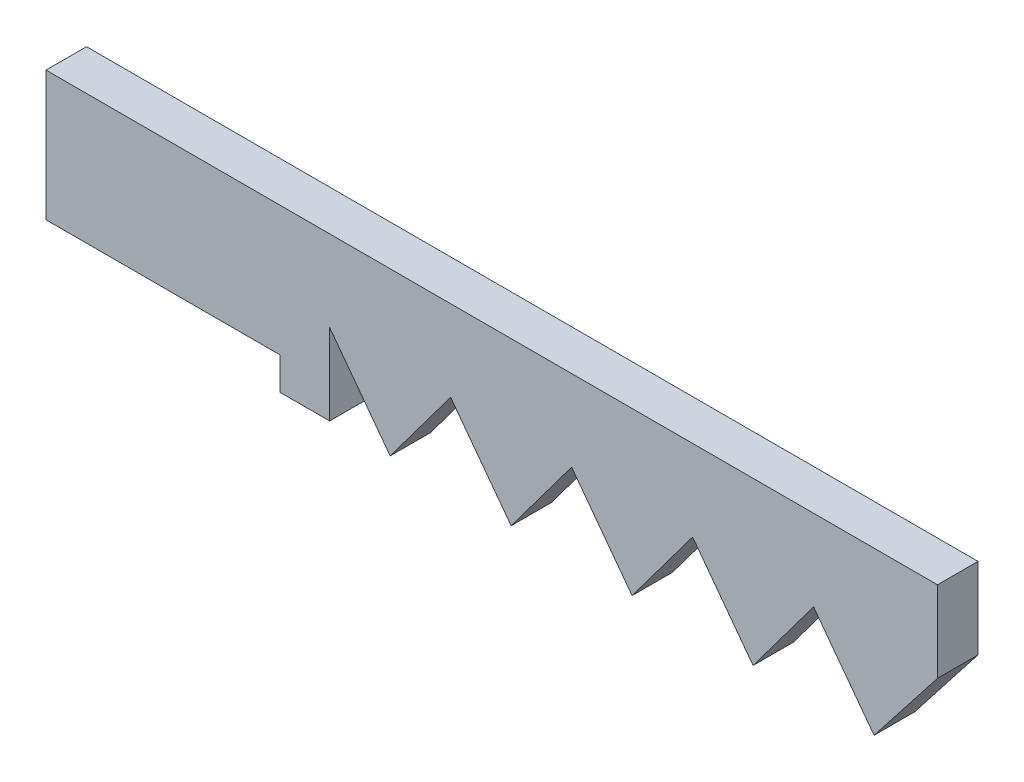
ISO-10303-21;
HEADER;
FILE_DESCRIPTION(('STEP AP214'),'2;1');
FILE_NAME('part.step','',(''),(''),'','','');
FILE_SCHEMA(('AUTOMOTIVE_DESIGN { 1 0 10303 214 1 1 1 1 }'));
ENDSEC;
DATA;
#1=APPLICATION_CONTEXT('core data for automotive mechanical design processes');
#2=APPLICATION_PROTOCOL_DEFINITION('international standard','automotive_design',2000,#1);
#3=PRODUCT_CONTEXT('',#1,'mechanical');
#4=PRODUCT('Part','Part','',(#3));
#5=PRODUCT_RELATED_PRODUCT_CATEGORY('part','',(#4));
#6=PRODUCT_DEFINITION_FORMATION('','',#4);
#7=PRODUCT_DEFINITION_CONTEXT('part definition',#1,'design');
#8=PRODUCT_DEFINITION('design','',#6,#7);
#9=PRODUCT_DEFINITION_SHAPE('','',#8);
#10=(LENGTH_UNIT() NAMED_UNIT(*) SI_UNIT(.MILLI.,.METRE.));
#11=(NAMED_UNIT(*) PLANE_ANGLE_UNIT() SI_UNIT($,.RADIAN.));
#12=(NAMED_UNIT(*) SI_UNIT($,.STERADIAN.) SOLID_ANGLE_UNIT());
#13=UNCERTAINTY_MEASURE_WITH_UNIT(LENGTH_MEASURE(1.E-05),#10,'distance_accuracy_value','');
#14=(GEOMETRIC_REPRESENTATION_CONTEXT(3) GLOBAL_UNCERTAINTY_ASSIGNED_CONTEXT((#13)) GLOBAL_UNIT_ASSIGNED_CONTEXT((#10,
#11,#12)) REPRESENTATION_CONTEXT('',''));
#15=CARTESIAN_POINT('',(0.,0.,0.));
#16=DIRECTION('',(0.,0.,1.));
#17=DIRECTION('',(1.,0.,0.));
#18=AXIS2_PLACEMENT_3D('',#15,#16,#17);
#19=CARTESIAN_POINT('',(-27.94,0.,2.54));
#20=DIRECTION('',(1.,0.,0.));
#21=DIRECTION('',(0.,1.,0.));
#22=AXIS2_PLACEMENT_3D('',#19,#20,#21);
#23=PLANE('',#22);
#24=DIRECTION('',(0.,0.,-1.));
#25=VECTOR('',#24,1.);
#26=CARTESIAN_POINT('',(-27.94,2.032,0.));
#27=LINE('',#26,#25);
#28=CARTESIAN_POINT('',(-27.94,2.032,2.54));
#29=VERTEX_POINT('',#28);
#30=CARTESIAN_POINT('',(-27.94,2.032,0.));
#31=VERTEX_POINT('',#30);
#32=EDGE_CURVE('E345',#29,#31,#27,.T.);
#33=ORIENTED_EDGE('',*,*,#32,.F.);
#34=DIRECTION('',(0.,-1.,0.));
#35=VECTOR('',#34,1.);
#36=CARTESIAN_POINT('',(-27.94,0.,2.54));
#37=LINE('',#36,#35);
#38=CARTESIAN_POINT('',(-27.94,10.16,2.54));
#39=VERTEX_POINT('',#38);
#40=EDGE_CURVE('E242',#39,#29,#37,.T.);
#41=ORIENTED_EDGE('',*,*,#40,.F.);
#42=DIRECTION('',(0.,0.,-1.));
#43=VECTOR('',#42,1.);
#44=CARTESIAN_POINT('',(-27.94,10.16,2.54));
#45=LINE('',#44,#43);
#46=CARTESIAN_POINT('',(-27.94,10.16,0.));
#47=VERTEX_POINT('',#46);
#48=EDGE_CURVE('E194',#39,#47,#45,.T.);
#49=ORIENTED_EDGE('',*,*,#48,.T.);
#50=DIRECTION('',(0.,-1.,0.));
#51=VECTOR('',#50,1.);
#52=CARTESIAN_POINT('',(-27.94,0.,0.));
#53=LINE('',#52,#51);
#54=EDGE_CURVE('E198',#47,#31,#53,.T.);
#55=ORIENTED_EDGE('',*,*,#54,.T.);
#56=EDGE_LOOP('',(#33,#41,#49,#55));
#57=FACE_BOUND('',#56,.T.);
#58=ADVANCED_FACE('F44',(#57),#23,.F.);
#59=CARTESIAN_POINT('',(-27.94,0.,2.54));
#60=DIRECTION('',(0.,1.,0.));
#61=DIRECTION('',(0.,0.,1.));
#62=AXIS2_PLACEMENT_3D('',#59,#60,#61);
#63=PLANE('',#62);
#64=CARTESIAN_POINT('',(-14.3884953171002,0.,1.27));
#65=DIRECTION('',(0.,-1.,0.));
#66=DIRECTION('',(0.,0.,1.));
#67=AXIS2_PLACEMENT_3D('',#64,#65,#66);
#68=CIRCLE('',#67,1.68849531710022);
#69=CARTESIAN_POINT('',(-13.2757885112123,0.,0.));
#70=VERTEX_POINT('',#69);
#71=CARTESIAN_POINT('',(-13.2757885112123,0.,2.54));
#72=VERTEX_POINT('',#71);
#73=EDGE_CURVE('E362',#70,#72,#68,.T.);
#74=ORIENTED_EDGE('',*,*,#73,.F.);
#75=DIRECTION('',(1.,0.,0.));
#76=VECTOR('',#75,1.);
#77=CARTESIAN_POINT('',(-27.94,0.,0.));
#78=LINE('',#77,#76);
#79=CARTESIAN_POINT('',(-10.16,0.,0.));
#80=VERTEX_POINT('',#79);
#81=EDGE_CURVE('E199',#70,#80,#78,.T.);
#82=ORIENTED_EDGE('',*,*,#81,.T.);
#83=DIRECTION('',(0.,0.,-1.));
#84=VECTOR('',#83,1.);
#85=CARTESIAN_POINT('',(-10.16,0.,2.54));
#86=LINE('',#85,#84);
#87=CARTESIAN_POINT('',(-10.16,0.,2.54));
#88=VERTEX_POINT('',#87);
#89=EDGE_CURVE('E11',#88,#80,#86,.T.);
#90=ORIENTED_EDGE('',*,*,#89,.F.);
#91=DIRECTION('',(1.,0.,0.));
#92=VECTOR('',#91,1.);
#93=CARTESIAN_POINT('',(-27.94,0.,2.54));
#94=LINE('',#93,#92);
#95=EDGE_CURVE('E126',#72,#88,#94,.T.);
#96=ORIENTED_EDGE('',*,*,#95,.F.);
#97=EDGE_LOOP('',(#74,#82,#90,#96));
#98=FACE_BOUND('',#97,.T.);
#99=ADVANCED_FACE('F360',(#98),#63,.F.);
#100=CARTESIAN_POINT('',(-10.16,5.08,2.54));
#101=DIRECTION('',(-1.,0.,0.));
#102=DIRECTION('',(0.,0.,1.));
#103=AXIS2_PLACEMENT_3D('',#100,#101,#102);
#104=PLANE('',#103);
#105=DIRECTION('',(0.,1.,0.));
#106=VECTOR('',#105,1.);
#107=CARTESIAN_POINT('',(-10.16,5.08,0.));
#108=LINE('',#107,#106);
#109=CARTESIAN_POINT('',(-10.16,5.08,0.));
#110=VERTEX_POINT('',#109);
#111=EDGE_CURVE('E204',#80,#110,#108,.T.);
#112=ORIENTED_EDGE('',*,*,#111,.T.);
#113=DIRECTION('',(0.,0.,-1.));
#114=VECTOR('',#113,1.);
#115=CARTESIAN_POINT('',(-10.16,5.08,2.54));
#116=LINE('',#115,#114);
#117=CARTESIAN_POINT('',(-10.16,5.08,2.54));
#118=VERTEX_POINT('',#117);
#119=EDGE_CURVE('E52',#118,#110,#116,.T.);
#120=ORIENTED_EDGE('',*,*,#119,.F.);
#121=DIRECTION('',(0.,1.,0.));
#122=VECTOR('',#121,1.);
#123=CARTESIAN_POINT('',(-10.16,5.08,2.54));
#124=LINE('',#123,#122);
#125=EDGE_CURVE('E346',#88,#118,#124,.T.);
#126=ORIENTED_EDGE('',*,*,#125,.F.);
#127=ORIENTED_EDGE('',*,*,#89,.T.);
#128=EDGE_LOOP('',(#112,#120,#126,#127));
#129=FACE_BOUND('',#128,.T.);
#130=ADVANCED_FACE('F358',(#129),#104,.F.);
#131=CARTESIAN_POINT('',(-10.16,5.08,2.54));
#132=DIRECTION('',(0.80139117034102,0.598140612314069,0.));
#133=DIRECTION('',(-0.598140612314069,0.801391170341021,0.));
#134=AXIS2_PLACEMENT_3D('',#131,#132,#133);
#135=PLANE('',#134);
#136=DIRECTION('',(0.598140612314069,-0.801391170341021,0.));
#137=VECTOR('',#136,1.);
#138=CARTESIAN_POINT('',(-10.16,5.08,0.));
#139=LINE('',#138,#137);
#140=CARTESIAN_POINT('',(-6.36840056265849,0.,0.));
#141=VERTEX_POINT('',#140);
#142=EDGE_CURVE('E210',#110,#141,#139,.T.);
#143=ORIENTED_EDGE('',*,*,#142,.T.);
#144=DIRECTION('',(0.,0.,-1.));
#145=VECTOR('',#144,1.);
#146=CARTESIAN_POINT('',(-6.36840056265849,0.,2.54));
#147=LINE('',#146,#145);
#148=CARTESIAN_POINT('',(-6.36840056265849,0.,2.54));
#149=VERTEX_POINT('',#148);
#150=EDGE_CURVE('E277',#149,#141,#147,.T.);
#151=ORIENTED_EDGE('',*,*,#150,.F.);
#152=DIRECTION('',(0.598140612314069,-0.801391170341021,0.));
#153=VECTOR('',#152,1.);
#154=CARTESIAN_POINT('',(-10.16,5.08,2.54));
#155=LINE('',#154,#153);
#156=EDGE_CURVE('E289',#118,#149,#155,.T.);
#157=ORIENTED_EDGE('',*,*,#156,.F.);
#158=ORIENTED_EDGE('',*,*,#119,.T.);
#159=EDGE_LOOP('',(#143,#151,#157,#158));
#160=FACE_BOUND('',#159,.T.);
#161=ADVANCED_FACE('F283',(#160),#135,.F.);
#162=CARTESIAN_POINT('',(-6.36840056265849,0.,2.54));
#163=DIRECTION('',(-0.801391170341021,0.598140612314069,0.));
#164=DIRECTION('',(-0.598140612314069,-0.801391170341021,0.));
#165=AXIS2_PLACEMENT_3D('',#162,#163,#164);
#166=PLANE('',#165);
#167=DIRECTION('',(0.598140612314069,0.801391170341021,0.));
#168=VECTOR('',#167,1.);
#169=CARTESIAN_POINT('',(-6.36840056265849,0.,0.));
#170=LINE('',#169,#168);
#171=CARTESIAN_POINT('',(-2.57680112531699,5.08,0.));
#172=VERTEX_POINT('',#171);
#173=EDGE_CURVE('E209',#141,#172,#170,.T.);
#174=ORIENTED_EDGE('',*,*,#173,.T.);
#175=DIRECTION('',(0.,0.,-1.));
#176=VECTOR('',#175,1.);
#177=CARTESIAN_POINT('',(-2.57680112531699,5.08,2.54));
#178=LINE('',#177,#176);
#179=CARTESIAN_POINT('',(-2.57680112531699,5.08,2.54));
#180=VERTEX_POINT('',#179);
#181=EDGE_CURVE('E275',#180,#172,#178,.T.);
#182=ORIENTED_EDGE('',*,*,#181,.F.);
#183=DIRECTION('',(0.598140612314069,0.801391170341021,0.));
#184=VECTOR('',#183,1.);
#185=CARTESIAN_POINT('',(-6.36840056265849,0.,2.54));
#186=LINE('',#185,#184);
#187=EDGE_CURVE('E310',#149,#180,#186,.T.);
#188=ORIENTED_EDGE('',*,*,#187,.F.);
#189=ORIENTED_EDGE('',*,*,#150,.T.);
#190=EDGE_LOOP('',(#174,#182,#188,#189));
#191=FACE_BOUND('',#190,.T.);
#192=ADVANCED_FACE('F296',(#191),#166,.F.);
#193=CARTESIAN_POINT('',(-2.57680112531699,5.08,2.54));
#194=DIRECTION('',(0.801391170341021,0.598140612314069,0.));
#195=DIRECTION('',(-0.598140612314069,0.801391170341021,0.));
#196=AXIS2_PLACEMENT_3D('',#193,#194,#195);
#197=PLANE('',#196);
#198=DIRECTION('',(0.598140612314069,-0.801391170341021,0.));
#199=VECTOR('',#198,1.);
#200=CARTESIAN_POINT('',(-2.57680112531699,5.08,0.));
#201=LINE('',#200,#199);
#202=CARTESIAN_POINT('',(1.21479831202452,0.,0.));
#203=VERTEX_POINT('',#202);
#204=EDGE_CURVE('E213',#172,#203,#201,.T.);
#205=ORIENTED_EDGE('',*,*,#204,.T.);
#206=DIRECTION('',(0.,0.,-1.));
#207=VECTOR('',#206,1.);
#208=CARTESIAN_POINT('',(1.21479831202452,0.,2.54));
#209=LINE('',#208,#207);
#210=CARTESIAN_POINT('',(1.21479831202452,0.,2.54));
#211=VERTEX_POINT('',#210);
#212=EDGE_CURVE('E268',#211,#203,#209,.T.);
#213=ORIENTED_EDGE('',*,*,#212,.F.);
#214=DIRECTION('',(0.598140612314069,-0.801391170341021,0.));
#215=VECTOR('',#214,1.);
#216=CARTESIAN_POINT('',(-2.57680112531699,5.08,2.54));
#217=LINE('',#216,#215);
#218=EDGE_CURVE('E301',#180,#211,#217,.T.);
#219=ORIENTED_EDGE('',*,*,#218,.F.);
#220=ORIENTED_EDGE('',*,*,#181,.T.);
#221=EDGE_LOOP('',(#205,#213,#219,#220));
#222=FACE_BOUND('',#221,.T.);
#223=ADVANCED_FACE('F302',(#222),#197,.F.);
#224=CARTESIAN_POINT('',(1.21479831202452,0.,2.54));
#225=DIRECTION('',(-0.801391170341021,0.598140612314069,0.));
#226=DIRECTION('',(-0.598140612314069,-0.80139117034102,0.));
#227=AXIS2_PLACEMENT_3D('',#224,#225,#226);
#228=PLANE('',#227);
#229=DIRECTION('',(0.598140612314069,0.801391170341021,0.));
#230=VECTOR('',#229,1.);
#231=CARTESIAN_POINT('',(1.21479831202452,0.,0.));
#232=LINE('',#231,#230);
#233=CARTESIAN_POINT('',(5.00639774936603,5.08,0.));
#234=VERTEX_POINT('',#233);
#235=EDGE_CURVE('E216',#203,#234,#232,.T.);
#236=ORIENTED_EDGE('',*,*,#235,.T.);
#237=DIRECTION('',(0.,0.,-1.));
#238=VECTOR('',#237,1.);
#239=CARTESIAN_POINT('',(5.00639774936603,5.08,2.54));
#240=LINE('',#239,#238);
#241=CARTESIAN_POINT('',(5.00639774936603,5.08,2.54));
#242=VERTEX_POINT('',#241);
#243=EDGE_CURVE('E262',#242,#234,#240,.T.);
#244=ORIENTED_EDGE('',*,*,#243,.F.);
#245=DIRECTION('',(0.598140612314069,0.801391170341021,0.));
#246=VECTOR('',#245,1.);
#247=CARTESIAN_POINT('',(1.21479831202452,0.,2.54));
#248=LINE('',#247,#246);
#249=EDGE_CURVE('E306',#211,#242,#248,.T.);
#250=ORIENTED_EDGE('',*,*,#249,.F.);
#251=ORIENTED_EDGE('',*,*,#212,.T.);
#252=EDGE_LOOP('',(#236,#244,#250,#251));
#253=FACE_BOUND('',#252,.T.);
#254=ADVANCED_FACE('F411',(#253),#228,.F.);
#255=CARTESIAN_POINT('',(5.00639774936603,5.08,2.54));
#256=DIRECTION('',(0.801391170341021,0.598140612314069,0.));
#257=DIRECTION('',(-0.598140612314069,0.801391170341021,0.));
#258=AXIS2_PLACEMENT_3D('',#255,#256,#257);
#259=PLANE('',#258);
#260=DIRECTION('',(0.598140612314069,-0.801391170341021,0.));
#261=VECTOR('',#260,1.);
#262=CARTESIAN_POINT('',(5.00639774936603,5.08,0.));
#263=LINE('',#262,#261);
#264=CARTESIAN_POINT('',(8.79799718670754,0.,0.));
#265=VERTEX_POINT('',#264);
#266=EDGE_CURVE('E218',#234,#265,#263,.T.);
#267=ORIENTED_EDGE('',*,*,#266,.T.);
#268=DIRECTION('',(0.,0.,-1.));
#269=VECTOR('',#268,1.);
#270=CARTESIAN_POINT('',(8.79799718670754,0.,2.54));
#271=LINE('',#270,#269);
#272=CARTESIAN_POINT('',(8.79799718670754,0.,2.54));
#273=VERTEX_POINT('',#272);
#274=EDGE_CURVE('E257',#273,#265,#271,.T.);
#275=ORIENTED_EDGE('',*,*,#274,.F.);
#276=DIRECTION('',(0.598140612314069,-0.801391170341021,0.));
#277=VECTOR('',#276,1.);
#278=CARTESIAN_POINT('',(5.00639774936603,5.08,2.54));
#279=LINE('',#278,#277);
#280=EDGE_CURVE('E311',#242,#273,#279,.T.);
#281=ORIENTED_EDGE('',*,*,#280,.F.);
#282=ORIENTED_EDGE('',*,*,#243,.T.);
#283=EDGE_LOOP('',(#267,#275,#281,#282));
#284=FACE_BOUND('',#283,.T.);
#285=ADVANCED_FACE('F416',(#284),#259,.F.);
#286=CARTESIAN_POINT('',(8.79799718670754,0.,2.54));
#287=DIRECTION('',(-0.801391170341021,0.598140612314069,0.));
#288=DIRECTION('',(-0.598140612314069,-0.801391170341021,0.));
#289=AXIS2_PLACEMENT_3D('',#286,#287,#288);
#290=PLANE('',#289);
#291=DIRECTION('',(0.598140612314069,0.801391170341021,0.));
#292=VECTOR('',#291,1.);
#293=CARTESIAN_POINT('',(8.79799718670754,0.,0.));
#294=LINE('',#293,#292);
#295=CARTESIAN_POINT('',(12.589596624049,5.08,0.));
#296=VERTEX_POINT('',#295);
#297=EDGE_CURVE('E225',#265,#296,#294,.T.);
#298=ORIENTED_EDGE('',*,*,#297,.T.);
#299=DIRECTION('',(0.,0.,-1.));
#300=VECTOR('',#299,1.);
#301=CARTESIAN_POINT('',(12.589596624049,5.08,2.54));
#302=LINE('',#301,#300);
#303=CARTESIAN_POINT('',(12.589596624049,5.08,2.54));
#304=VERTEX_POINT('',#303);
#305=EDGE_CURVE('E258',#304,#296,#302,.T.);
#306=ORIENTED_EDGE('',*,*,#305,.F.);
#307=DIRECTION('',(0.598140612314069,0.801391170341021,0.));
#308=VECTOR('',#307,1.);
#309=CARTESIAN_POINT('',(8.79799718670754,0.,2.54));
#310=LINE('',#309,#308);
#311=EDGE_CURVE('E319',#273,#304,#310,.T.);
#312=ORIENTED_EDGE('',*,*,#311,.F.);
#313=ORIENTED_EDGE('',*,*,#274,.T.);
#314=EDGE_LOOP('',(#298,#306,#312,#313));
#315=FACE_BOUND('',#314,.T.);
#316=ADVANCED_FACE('F425',(#315),#290,.F.);
#317=CARTESIAN_POINT('',(12.589596624049,5.08,2.54));
#318=DIRECTION('',(0.801391170341021,0.598140612314069,0.));
#319=DIRECTION('',(-0.598140612314069,0.801391170341021,0.));
#320=AXIS2_PLACEMENT_3D('',#317,#318,#319);
#321=PLANE('',#320);
#322=DIRECTION('',(0.598140612314069,-0.801391170341021,0.));
#323=VECTOR('',#322,1.);
#324=CARTESIAN_POINT('',(12.589596624049,5.08,0.));
#325=LINE('',#324,#323);
#326=CARTESIAN_POINT('',(16.3811960613906,0.,0.));
#327=VERTEX_POINT('',#326);
#328=EDGE_CURVE('E223',#296,#327,#325,.T.);
#329=ORIENTED_EDGE('',*,*,#328,.T.);
#330=DIRECTION('',(0.,0.,-1.));
#331=VECTOR('',#330,1.);
#332=CARTESIAN_POINT('',(16.3811960613906,0.,2.54));
#333=LINE('',#332,#331);
#334=CARTESIAN_POINT('',(16.3811960613906,0.,2.54));
#335=VERTEX_POINT('',#334);
#336=EDGE_CURVE('E252',#335,#327,#333,.T.);
#337=ORIENTED_EDGE('',*,*,#336,.F.);
#338=DIRECTION('',(0.598140612314069,-0.801391170341021,0.));
#339=VECTOR('',#338,1.);
#340=CARTESIAN_POINT('',(12.589596624049,5.08,2.54));
#341=LINE('',#340,#339);
#342=EDGE_CURVE('E323',#304,#335,#341,.T.);
#343=ORIENTED_EDGE('',*,*,#342,.F.);
#344=ORIENTED_EDGE('',*,*,#305,.T.);
#345=EDGE_LOOP('',(#329,#337,#343,#344));
#346=FACE_BOUND('',#345,.T.);
#347=ADVANCED_FACE('F426',(#346),#321,.F.);
#348=CARTESIAN_POINT('',(16.3811960613906,0.,2.54));
#349=DIRECTION('',(-0.801391170341021,0.598140612314069,0.));
#350=DIRECTION('',(-0.598140612314069,-0.801391170341021,0.));
#351=AXIS2_PLACEMENT_3D('',#348,#349,#350);
#352=PLANE('',#351);
#353=DIRECTION('',(0.598140612314069,0.801391170341021,0.));
#354=VECTOR('',#353,1.);
#355=CARTESIAN_POINT('',(16.3811960613906,0.,0.));
#356=LINE('',#355,#354);
#357=CARTESIAN_POINT('',(20.1727954987321,5.08,0.));
#358=VERTEX_POINT('',#357);
#359=EDGE_CURVE('E229',#327,#358,#356,.T.);
#360=ORIENTED_EDGE('',*,*,#359,.T.);
#361=DIRECTION('',(0.,0.,-1.));
#362=VECTOR('',#361,1.);
#363=CARTESIAN_POINT('',(20.1727954987321,5.08,2.54));
#364=LINE('',#363,#362);
#365=CARTESIAN_POINT('',(20.1727954987321,5.08,2.54));
#366=VERTEX_POINT('',#365);
#367=EDGE_CURVE('E247',#366,#358,#364,.T.);
#368=ORIENTED_EDGE('',*,*,#367,.F.);
#369=DIRECTION('',(0.598140612314069,0.801391170341021,0.));
#370=VECTOR('',#369,1.);
#371=CARTESIAN_POINT('',(16.3811960613906,0.,2.54));
#372=LINE('',#371,#370);
#373=EDGE_CURVE('E326',#335,#366,#372,.T.);
#374=ORIENTED_EDGE('',*,*,#373,.F.);
#375=ORIENTED_EDGE('',*,*,#336,.T.);
#376=EDGE_LOOP('',(#360,#368,#374,#375));
#377=FACE_BOUND('',#376,.T.);
#378=ADVANCED_FACE('F331',(#377),#352,.F.);
#379=CARTESIAN_POINT('',(20.1727954987321,5.08,2.54));
#380=DIRECTION('',(0.801391170341021,0.598140612314069,0.));
#381=DIRECTION('',(-0.598140612314069,0.801391170341021,0.));
#382=AXIS2_PLACEMENT_3D('',#379,#380,#381);
#383=PLANE('',#382);
#384=DIRECTION('',(0.598140612314069,-0.801391170341021,0.));
#385=VECTOR('',#384,1.);
#386=CARTESIAN_POINT('',(20.1727954987321,5.08,0.));
#387=LINE('',#386,#385);
#388=CARTESIAN_POINT('',(23.9643949360736,0.,0.));
#389=VERTEX_POINT('',#388);
#390=EDGE_CURVE('E233',#358,#389,#387,.T.);
#391=ORIENTED_EDGE('',*,*,#390,.T.);
#392=DIRECTION('',(0.,0.,-1.));
#393=VECTOR('',#392,1.);
#394=CARTESIAN_POINT('',(23.9643949360736,0.,2.54));
#395=LINE('',#394,#393);
#396=CARTESIAN_POINT('',(23.9643949360736,0.,2.54));
#397=VERTEX_POINT('',#396);
#398=EDGE_CURVE('E183',#397,#389,#395,.T.);
#399=ORIENTED_EDGE('',*,*,#398,.F.);
#400=DIRECTION('',(0.598140612314069,-0.801391170341021,0.));
#401=VECTOR('',#400,1.);
#402=CARTESIAN_POINT('',(20.1727954987321,5.08,2.54));
#403=LINE('',#402,#401);
#404=EDGE_CURVE('E172',#366,#397,#403,.T.);
#405=ORIENTED_EDGE('',*,*,#404,.F.);
#406=ORIENTED_EDGE('',*,*,#367,.T.);
#407=EDGE_LOOP('',(#391,#399,#405,#406));
#408=FACE_BOUND('',#407,.T.);
#409=ADVANCED_FACE('F339',(#408),#383,.F.);
#410=CARTESIAN_POINT('',(23.9643949360736,0.,2.54));
#411=DIRECTION('',(-0.787508545501686,0.616303732555481,0.));
#412=DIRECTION('',(-0.616303732555481,-0.787508545501686,0.));
#413=AXIS2_PLACEMENT_3D('',#410,#411,#412);
#414=PLANE('',#413);
#415=DIRECTION('',(0.616303732555481,0.787508545501686,0.));
#416=VECTOR('',#415,1.);
#417=CARTESIAN_POINT('',(23.9643949360736,0.,0.));
#418=LINE('',#417,#416);
#419=CARTESIAN_POINT('',(27.94,5.08,0.));
#420=VERTEX_POINT('',#419);
#421=EDGE_CURVE('E182',#389,#420,#418,.T.);
#422=ORIENTED_EDGE('',*,*,#421,.T.);
#423=DIRECTION('',(0.,0.,-1.));
#424=VECTOR('',#423,1.);
#425=CARTESIAN_POINT('',(27.94,5.08,2.54));
#426=LINE('',#425,#424);
#427=CARTESIAN_POINT('',(27.94,5.08,2.54));
#428=VERTEX_POINT('',#427);
#429=EDGE_CURVE('E177',#428,#420,#426,.T.);
#430=ORIENTED_EDGE('',*,*,#429,.F.);
#431=DIRECTION('',(0.616303732555481,0.787508545501686,0.));
#432=VECTOR('',#431,1.);
#433=CARTESIAN_POINT('',(23.9643949360736,0.,2.54));
#434=LINE('',#433,#432);
#435=EDGE_CURVE('E162',#397,#428,#434,.T.);
#436=ORIENTED_EDGE('',*,*,#435,.F.);
#437=ORIENTED_EDGE('',*,*,#398,.T.);
#438=EDGE_LOOP('',(#422,#430,#436,#437));
#439=FACE_BOUND('',#438,.T.);
#440=ADVANCED_FACE('F180',(#439),#414,.F.);
#441=CARTESIAN_POINT('',(27.94,5.08,2.54));
#442=DIRECTION('',(-1.,0.,0.));
#443=DIRECTION('',(0.,0.,1.));
#444=AXIS2_PLACEMENT_3D('',#441,#442,#443);
#445=PLANE('',#444);
#446=DIRECTION('',(0.,1.,0.));
#447=VECTOR('',#446,1.);
#448=CARTESIAN_POINT('',(27.94,5.08,0.));
#449=LINE('',#448,#447);
#450=CARTESIAN_POINT('',(27.94,10.16,0.));
#451=VERTEX_POINT('',#450);
#452=EDGE_CURVE('E237',#420,#451,#449,.T.);
#453=ORIENTED_EDGE('',*,*,#452,.T.);
#454=DIRECTION('',(0.,0.,-1.));
#455=VECTOR('',#454,1.);
#456=CARTESIAN_POINT('',(27.94,10.16,2.54));
#457=LINE('',#456,#455);
#458=CARTESIAN_POINT('',(27.94,10.16,2.54));
#459=VERTEX_POINT('',#458);
#460=EDGE_CURVE('E187',#459,#451,#457,.T.);
#461=ORIENTED_EDGE('',*,*,#460,.F.);
#462=DIRECTION('',(0.,1.,0.));
#463=VECTOR('',#462,1.);
#464=CARTESIAN_POINT('',(27.94,5.08,2.54));
#465=LINE('',#464,#463);
#466=EDGE_CURVE('E169',#428,#459,#465,.T.);
#467=ORIENTED_EDGE('',*,*,#466,.F.);
#468=ORIENTED_EDGE('',*,*,#429,.T.);
#469=EDGE_LOOP('',(#453,#461,#467,#468));
#470=FACE_BOUND('',#469,.T.);
#471=ADVANCED_FACE('F189',(#470),#445,.F.);
#472=CARTESIAN_POINT('',(-27.94,10.16,2.54));
#473=DIRECTION('',(0.,-1.,0.));
#474=DIRECTION('',(0.,0.,-1.));
#475=AXIS2_PLACEMENT_3D('',#472,#473,#474);
#476=PLANE('',#475);
#477=DIRECTION('',(-1.,0.,0.));
#478=VECTOR('',#477,1.);
#479=CARTESIAN_POINT('',(-27.94,10.16,0.));
#480=LINE('',#479,#478);
#481=EDGE_CURVE('E118',#451,#47,#480,.T.);
#482=ORIENTED_EDGE('',*,*,#481,.T.);
#483=ORIENTED_EDGE('',*,*,#48,.F.);
#484=DIRECTION('',(-1.,0.,0.));
#485=VECTOR('',#484,1.);
#486=CARTESIAN_POINT('',(-27.94,10.16,2.54));
#487=LINE('',#486,#485);
#488=EDGE_CURVE('E70',#459,#39,#487,.T.);
#489=ORIENTED_EDGE('',*,*,#488,.F.);
#490=ORIENTED_EDGE('',*,*,#460,.T.);
#491=EDGE_LOOP('',(#482,#483,#489,#490));
#492=FACE_BOUND('',#491,.T.);
#493=ADVANCED_FACE('F338',(#492),#476,.F.);
#494=CARTESIAN_POINT('',(0.,0.,2.54));
#495=DIRECTION('',(0.,0.,-1.));
#496=DIRECTION('',(-1.,0.,0.));
#497=AXIS2_PLACEMENT_3D('',#494,#495,#496);
#498=PLANE('',#497);
#499=DIRECTION('',(-1.,0.,0.));
#500=VECTOR('',#499,1.);
#501=CARTESIAN_POINT('',(-27.94,2.032,2.54));
#502=LINE('',#501,#500);
#503=CARTESIAN_POINT('',(-13.2757885112123,2.032,2.54));
#504=VERTEX_POINT('',#503);
#505=EDGE_CURVE('E372',#504,#29,#502,.T.);
#506=ORIENTED_EDGE('',*,*,#505,.F.);
#507=DIRECTION('',(0.,-1.,0.));
#508=VECTOR('',#507,1.);
#509=CARTESIAN_POINT('',(-13.2757885112123,2.032,2.54));
#510=LINE('',#509,#508);
#511=EDGE_CURVE('E203',#504,#72,#510,.T.);
#512=ORIENTED_EDGE('',*,*,#511,.T.);
#513=ORIENTED_EDGE('',*,*,#95,.T.);
#514=ORIENTED_EDGE('',*,*,#125,.T.);
#515=ORIENTED_EDGE('',*,*,#156,.T.);
#516=ORIENTED_EDGE('',*,*,#187,.T.);
#517=ORIENTED_EDGE('',*,*,#218,.T.);
#518=ORIENTED_EDGE('',*,*,#249,.T.);
#519=ORIENTED_EDGE('',*,*,#280,.T.);
#520=ORIENTED_EDGE('',*,*,#311,.T.);
#521=ORIENTED_EDGE('',*,*,#342,.T.);
#522=ORIENTED_EDGE('',*,*,#373,.T.);
#523=ORIENTED_EDGE('',*,*,#404,.T.);
#524=ORIENTED_EDGE('',*,*,#435,.T.);
#525=ORIENTED_EDGE('',*,*,#466,.T.);
#526=ORIENTED_EDGE('',*,*,#488,.T.);
#527=ORIENTED_EDGE('',*,*,#40,.T.);
#528=EDGE_LOOP('',(#506,#512,#513,#514,#515,#516,#517,#518,#519,#520,#521,#522,#523,#524,#525,
#526,#527));
#529=FACE_BOUND('',#528,.T.);
#530=ADVANCED_FACE('F167',(#529),#498,.F.);
#531=CARTESIAN_POINT('',(0.,0.,0.));
#532=DIRECTION('',(0.,0.,-1.));
#533=DIRECTION('',(-1.,0.,0.));
#534=AXIS2_PLACEMENT_3D('',#531,#532,#533);
#535=PLANE('',#534);
#536=DIRECTION('',(1.,0.,0.));
#537=VECTOR('',#536,1.);
#538=CARTESIAN_POINT('',(-27.94,2.032,0.));
#539=LINE('',#538,#537);
#540=CARTESIAN_POINT('',(-13.2757885112123,2.032,0.));
#541=VERTEX_POINT('',#540);
#542=EDGE_CURVE('E58',#31,#541,#539,.T.);
#543=ORIENTED_EDGE('',*,*,#542,.F.);
#544=ORIENTED_EDGE('',*,*,#54,.F.);
#545=ORIENTED_EDGE('',*,*,#481,.F.);
#546=ORIENTED_EDGE('',*,*,#452,.F.);
#547=ORIENTED_EDGE('',*,*,#421,.F.);
#548=ORIENTED_EDGE('',*,*,#390,.F.);
#549=ORIENTED_EDGE('',*,*,#359,.F.);
#550=ORIENTED_EDGE('',*,*,#328,.F.);
#551=ORIENTED_EDGE('',*,*,#297,.F.);
#552=ORIENTED_EDGE('',*,*,#266,.F.);
#553=ORIENTED_EDGE('',*,*,#235,.F.);
#554=ORIENTED_EDGE('',*,*,#204,.F.);
#555=ORIENTED_EDGE('',*,*,#173,.F.);
#556=ORIENTED_EDGE('',*,*,#142,.F.);
#557=ORIENTED_EDGE('',*,*,#111,.F.);
#558=ORIENTED_EDGE('',*,*,#81,.F.);
#559=DIRECTION('',(0.,-1.,0.));
#560=VECTOR('',#559,1.);
#561=CARTESIAN_POINT('',(-13.2757885112123,2.032,0.));
#562=LINE('',#561,#560);
#563=EDGE_CURVE('E352',#541,#70,#562,.T.);
#564=ORIENTED_EDGE('',*,*,#563,.F.);
#565=EDGE_LOOP('',(#543,#544,#545,#546,#547,#548,#549,#550,#551,#552,#553,#554,#555,#556,#557,
#558,#564));
#566=FACE_BOUND('',#565,.T.);
#567=ADVANCED_FACE('F291',(#566),#535,.T.);
#568=CARTESIAN_POINT('',(-14.3884953171002,2.032,1.27));
#569=DIRECTION('',(0.,-1.,0.));
#570=DIRECTION('',(0.,0.,-1.));
#571=AXIS2_PLACEMENT_3D('',#568,#569,#570);
#572=CYLINDRICAL_SURFACE('',#571,1.68849531710022);
#573=ORIENTED_EDGE('',*,*,#73,.T.);
#574=ORIENTED_EDGE('',*,*,#511,.F.);
#575=CARTESIAN_POINT('',(-14.3884953171002,2.032,1.27));
#576=DIRECTION('',(0.,-1.,0.));
#577=DIRECTION('',(0.,0.,1.));
#578=AXIS2_PLACEMENT_3D('',#575,#576,#577);
#579=CIRCLE('',#578,1.68849531710022);
#580=EDGE_CURVE('E378',#541,#504,#579,.T.);
#581=ORIENTED_EDGE('',*,*,#580,.F.);
#582=ORIENTED_EDGE('',*,*,#563,.T.);
#583=EDGE_LOOP('',(#573,#574,#581,#582));
#584=FACE_BOUND('',#583,.T.);
#585=ADVANCED_FACE('F389',(#584),#572,.F.);
#586=CARTESIAN_POINT('',(-14.3884953171002,2.032,1.27));
#587=DIRECTION('',(0.,1.,0.));
#588=DIRECTION('',(0.,0.,1.));
#589=AXIS2_PLACEMENT_3D('',#586,#587,#588);
#590=PLANE('',#589);
#591=ORIENTED_EDGE('',*,*,#32,.T.);
#592=ORIENTED_EDGE('',*,*,#542,.T.);
#593=ORIENTED_EDGE('',*,*,#580,.T.);
#594=ORIENTED_EDGE('',*,*,#505,.T.);
#595=EDGE_LOOP('',(#591,#592,#593,#594));
#596=FACE_BOUND('',#595,.T.);
#597=ADVANCED_FACE('F373',(#596),#590,.F.);
#598=CLOSED_SHELL('',(#58,#99,#130,#161,#192,#223,#254,#285,#316,#347,#378,#409,#440,#471,#493,
#530,#567,#585,#597));
#599=MANIFOLD_SOLID_BREP('B2',#598);
#600=ADVANCED_BREP_SHAPE_REPRESENTATION('',(#18,#599),#14);
#601=SHAPE_DEFINITION_REPRESENTATION(#9,#600);
ENDSEC;
END-ISO-10303-21;
